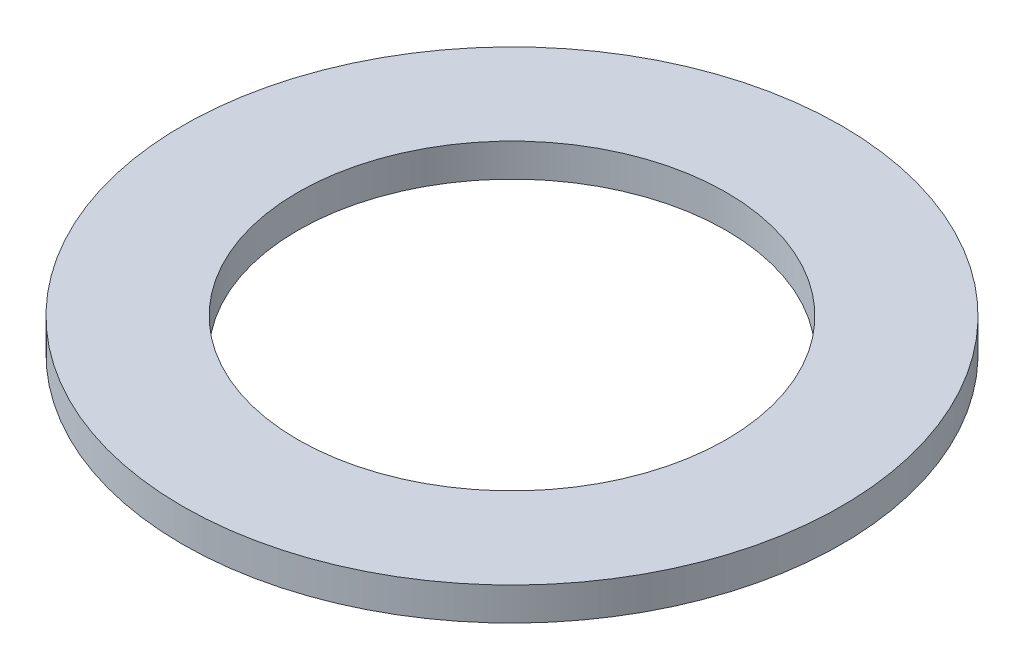
ISO-10303-21;
HEADER;
FILE_DESCRIPTION(('STEP AP214'),'2;1');
FILE_NAME('part.step','',(''),(''),'','','');
FILE_SCHEMA(('AUTOMOTIVE_DESIGN { 1 0 10303 214 1 1 1 1 }'));
ENDSEC;
DATA;
#1=APPLICATION_CONTEXT('core data for automotive mechanical design processes');
#2=APPLICATION_PROTOCOL_DEFINITION('international standard','automotive_design',2000,#1);
#3=PRODUCT_CONTEXT('',#1,'mechanical');
#4=PRODUCT('Part','Part','',(#3));
#5=PRODUCT_RELATED_PRODUCT_CATEGORY('part','',(#4));
#6=PRODUCT_DEFINITION_FORMATION('','',#4);
#7=PRODUCT_DEFINITION_CONTEXT('part definition',#1,'design');
#8=PRODUCT_DEFINITION('design','',#6,#7);
#9=PRODUCT_DEFINITION_SHAPE('','',#8);
#10=(LENGTH_UNIT() NAMED_UNIT(*) SI_UNIT(.MILLI.,.METRE.));
#11=(NAMED_UNIT(*) PLANE_ANGLE_UNIT() SI_UNIT($,.RADIAN.));
#12=(NAMED_UNIT(*) SI_UNIT($,.STERADIAN.) SOLID_ANGLE_UNIT());
#13=UNCERTAINTY_MEASURE_WITH_UNIT(LENGTH_MEASURE(1.E-05),#10,'distance_accuracy_value','');
#14=(GEOMETRIC_REPRESENTATION_CONTEXT(3) GLOBAL_UNCERTAINTY_ASSIGNED_CONTEXT((#13)) GLOBAL_UNIT_ASSIGNED_CONTEXT((#10,
#11,#12)) REPRESENTATION_CONTEXT('',''));
#15=CARTESIAN_POINT('',(0.,0.,0.));
#16=DIRECTION('',(0.,0.,1.));
#17=DIRECTION('',(1.,0.,0.));
#18=AXIS2_PLACEMENT_3D('',#15,#16,#17);
#19=CARTESIAN_POINT('',(0.,1.,0.));
#20=DIRECTION('',(0.,1.,0.));
#21=DIRECTION('',(0.,0.,1.));
#22=AXIS2_PLACEMENT_3D('',#19,#20,#21);
#23=PLANE('',#22);
#24=CARTESIAN_POINT('',(0.,1.,0.));
#25=DIRECTION('',(0.,1.,0.));
#26=DIRECTION('',(0.,0.,1.));
#27=AXIS2_PLACEMENT_3D('',#24,#25,#26);
#28=CIRCLE('',#27,10.);
#29=CARTESIAN_POINT('',(0.,1.,10.));
#30=VERTEX_POINT('',#29);
#31=EDGE_CURVE('E10',#30,#30,#28,.T.);
#32=ORIENTED_EDGE('',*,*,#31,.T.);
#33=EDGE_LOOP('',(#32));
#34=FACE_BOUND('',#33,.T.);
#35=CARTESIAN_POINT('',(0.,1.,0.));
#36=DIRECTION('',(0.,1.,0.));
#37=DIRECTION('',(0.,0.,1.));
#38=AXIS2_PLACEMENT_3D('',#35,#36,#37);
#39=CIRCLE('',#38,6.5);
#40=CARTESIAN_POINT('',(0.,1.,6.5));
#41=VERTEX_POINT('',#40);
#42=EDGE_CURVE('E46',#41,#41,#39,.T.);
#43=ORIENTED_EDGE('',*,*,#42,.F.);
#44=EDGE_LOOP('',(#43));
#45=FACE_BOUND('',#44,.T.);
#46=ADVANCED_FACE('F35',(#34,#45),#23,.T.);
#47=CARTESIAN_POINT('',(0.,0.,0.));
#48=DIRECTION('',(0.,1.,0.));
#49=DIRECTION('',(0.,0.,1.));
#50=AXIS2_PLACEMENT_3D('',#47,#48,#49);
#51=PLANE('',#50);
#52=CARTESIAN_POINT('',(0.,0.,0.));
#53=DIRECTION('',(0.,1.,0.));
#54=DIRECTION('',(0.,0.,1.));
#55=AXIS2_PLACEMENT_3D('',#52,#53,#54);
#56=CIRCLE('',#55,10.);
#57=CARTESIAN_POINT('',(0.,0.,10.));
#58=VERTEX_POINT('',#57);
#59=EDGE_CURVE('E39',#58,#58,#56,.T.);
#60=ORIENTED_EDGE('',*,*,#59,.F.);
#61=EDGE_LOOP('',(#60));
#62=FACE_BOUND('',#61,.T.);
#63=CARTESIAN_POINT('',(0.,0.,0.));
#64=DIRECTION('',(0.,1.,0.));
#65=DIRECTION('',(0.,0.,1.));
#66=AXIS2_PLACEMENT_3D('',#63,#64,#65);
#67=CIRCLE('',#66,6.5);
#68=CARTESIAN_POINT('',(0.,0.,6.5));
#69=VERTEX_POINT('',#68);
#70=EDGE_CURVE('E48',#69,#69,#67,.T.);
#71=ORIENTED_EDGE('',*,*,#70,.T.);
#72=EDGE_LOOP('',(#71));
#73=FACE_BOUND('',#72,.T.);
#74=ADVANCED_FACE('F58',(#62,#73),#51,.F.);
#75=CARTESIAN_POINT('',(0.,1.,0.));
#76=DIRECTION('',(0.,-1.,0.));
#77=DIRECTION('',(0.,0.,-1.));
#78=AXIS2_PLACEMENT_3D('',#75,#76,#77);
#79=CYLINDRICAL_SURFACE('',#78,10.);
#80=ORIENTED_EDGE('',*,*,#31,.F.);
#81=EDGE_LOOP('',(#80));
#82=FACE_BOUND('',#81,.T.);
#83=ORIENTED_EDGE('',*,*,#59,.T.);
#84=EDGE_LOOP('',(#83));
#85=FACE_BOUND('',#84,.T.);
#86=ADVANCED_FACE('F37',(#82,#85),#79,.T.);
#87=CARTESIAN_POINT('',(0.,1.,0.));
#88=DIRECTION('',(0.,-1.,0.));
#89=DIRECTION('',(0.,0.,-1.));
#90=AXIS2_PLACEMENT_3D('',#87,#88,#89);
#91=CYLINDRICAL_SURFACE('',#90,6.5);
#92=ORIENTED_EDGE('',*,*,#42,.T.);
#93=EDGE_LOOP('',(#92));
#94=FACE_BOUND('',#93,.T.);
#95=ORIENTED_EDGE('',*,*,#70,.F.);
#96=EDGE_LOOP('',(#95));
#97=FACE_BOUND('',#96,.T.);
#98=ADVANCED_FACE('F54',(#94,#97),#91,.F.);
#99=CLOSED_SHELL('',(#46,#74,#86,#98));
#100=MANIFOLD_SOLID_BREP('B2',#99);
#101=ADVANCED_BREP_SHAPE_REPRESENTATION('',(#18,#100),#14);
#102=SHAPE_DEFINITION_REPRESENTATION(#9,#101);
ENDSEC;
END-ISO-10303-21;
